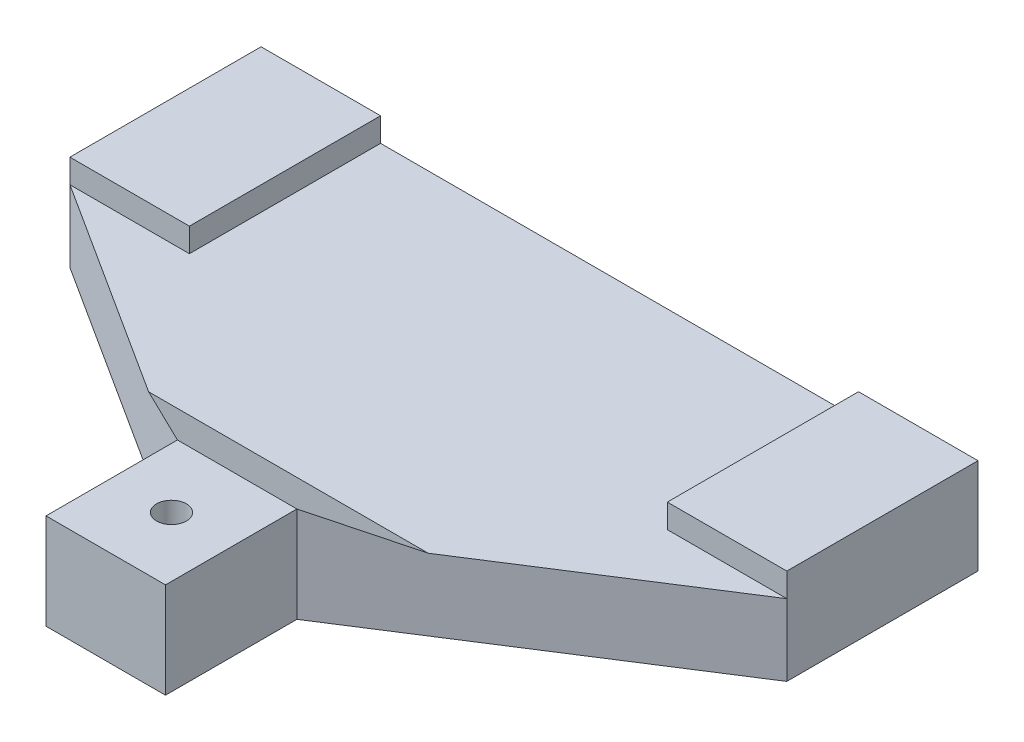
ISO-10303-21;
HEADER;
FILE_DESCRIPTION(('STEP AP214'),'2;1');
FILE_NAME('part.step','',(''),(''),'','','');
FILE_SCHEMA(('AUTOMOTIVE_DESIGN { 1 0 10303 214 1 1 1 1 }'));
ENDSEC;
DATA;
#1=APPLICATION_CONTEXT('core data for automotive mechanical design processes');
#2=APPLICATION_PROTOCOL_DEFINITION('international standard','automotive_design',2000,#1);
#3=PRODUCT_CONTEXT('',#1,'mechanical');
#4=PRODUCT('Part','Part','',(#3));
#5=PRODUCT_RELATED_PRODUCT_CATEGORY('part','',(#4));
#6=PRODUCT_DEFINITION_FORMATION('','',#4);
#7=PRODUCT_DEFINITION_CONTEXT('part definition',#1,'design');
#8=PRODUCT_DEFINITION('design','',#6,#7);
#9=PRODUCT_DEFINITION_SHAPE('','',#8);
#10=(LENGTH_UNIT() NAMED_UNIT(*) SI_UNIT(.MILLI.,.METRE.));
#11=(NAMED_UNIT(*) PLANE_ANGLE_UNIT() SI_UNIT($,.RADIAN.));
#12=(NAMED_UNIT(*) SI_UNIT($,.STERADIAN.) SOLID_ANGLE_UNIT());
#13=UNCERTAINTY_MEASURE_WITH_UNIT(LENGTH_MEASURE(1.E-05),#10,'distance_accuracy_value','');
#14=(GEOMETRIC_REPRESENTATION_CONTEXT(3) GLOBAL_UNCERTAINTY_ASSIGNED_CONTEXT((#13)) GLOBAL_UNIT_ASSIGNED_CONTEXT((#10,
#11,#12)) REPRESENTATION_CONTEXT('',''));
#15=CARTESIAN_POINT('',(0.,0.,0.));
#16=DIRECTION('',(0.,0.,1.));
#17=DIRECTION('',(1.,0.,0.));
#18=AXIS2_PLACEMENT_3D('',#15,#16,#17);
#19=CARTESIAN_POINT('',(0.,8.,60.));
#20=DIRECTION('',(0.,-1.,0.));
#21=DIRECTION('',(0.,0.,-1.));
#22=AXIS2_PLACEMENT_3D('',#19,#20,#21);
#23=PLANE('',#22);
#24=DIRECTION('',(0.,0.,-1.));
#25=VECTOR('',#24,1.);
#26=CARTESIAN_POINT('',(0.,8.,60.));
#27=LINE('',#26,#25);
#28=CARTESIAN_POINT('',(0.,8.,16.));
#29=VERTEX_POINT('',#28);
#30=CARTESIAN_POINT('',(0.,8.,0.));
#31=VERTEX_POINT('',#30);
#32=EDGE_CURVE('E228',#29,#31,#27,.T.);
#33=ORIENTED_EDGE('',*,*,#32,.F.);
#34=DIRECTION('',(-1.,0.,0.));
#35=VECTOR('',#34,1.);
#36=CARTESIAN_POINT('',(0.,8.,16.));
#37=LINE('',#36,#35);
#38=CARTESIAN_POINT('',(10.,8.,16.));
#39=VERTEX_POINT('',#38);
#40=EDGE_CURVE('E164',#39,#29,#37,.T.);
#41=ORIENTED_EDGE('',*,*,#40,.F.);
#42=DIRECTION('',(0.,0.,1.));
#43=VECTOR('',#42,1.);
#44=CARTESIAN_POINT('',(10.,8.,16.));
#45=LINE('',#44,#43);
#46=CARTESIAN_POINT('',(10.,8.,0.));
#47=VERTEX_POINT('',#46);
#48=EDGE_CURVE('E180',#47,#39,#45,.T.);
#49=ORIENTED_EDGE('',*,*,#48,.F.);
#50=DIRECTION('',(-1.,0.,0.));
#51=VECTOR('',#50,1.);
#52=CARTESIAN_POINT('',(0.,8.,0.));
#53=LINE('',#52,#51);
#54=EDGE_CURVE('E224',#47,#31,#53,.T.);
#55=ORIENTED_EDGE('',*,*,#54,.T.);
#56=EDGE_LOOP('',(#33,#41,#49,#55));
#57=FACE_BOUND('',#56,.T.);
#58=ADVANCED_FACE('F33',(#57),#23,.F.);
#59=CARTESIAN_POINT('',(30.,8.,37.5));
#60=DIRECTION('',(0.,1.,0.));
#61=DIRECTION('',(0.,0.,1.));
#62=AXIS2_PLACEMENT_3D('',#59,#60,#61);
#63=CIRCLE('',#62,1.25);
#64=CARTESIAN_POINT('',(30.,8.,38.75));
#65=VERTEX_POINT('',#64);
#66=EDGE_CURVE('E187',#65,#65,#63,.T.);
#67=ORIENTED_EDGE('',*,*,#66,.F.);
#68=EDGE_LOOP('',(#67));
#69=FACE_BOUND('',#68,.T.);
#70=DIRECTION('',(0.,0.,1.));
#71=VECTOR('',#70,1.);
#72=CARTESIAN_POINT('',(25.,8.,32.));
#73=LINE('',#72,#71);
#74=CARTESIAN_POINT('',(25.,7.99999999999999,32.));
#75=VERTEX_POINT('',#74);
#76=CARTESIAN_POINT('',(25.,8.,43.));
#77=VERTEX_POINT('',#76);
#78=EDGE_CURVE('E152',#75,#77,#73,.T.);
#79=ORIENTED_EDGE('',*,*,#78,.T.);
#80=DIRECTION('',(1.,0.,0.));
#81=VECTOR('',#80,1.);
#82=CARTESIAN_POINT('',(25.,8.,43.));
#83=LINE('',#82,#81);
#84=CARTESIAN_POINT('',(35.,8.,43.));
#85=VERTEX_POINT('',#84);
#86=EDGE_CURVE('E137',#77,#85,#83,.T.);
#87=ORIENTED_EDGE('',*,*,#86,.T.);
#88=DIRECTION('',(0.,0.,-1.));
#89=VECTOR('',#88,1.);
#90=CARTESIAN_POINT('',(35.,8.,43.));
#91=LINE('',#90,#89);
#92=CARTESIAN_POINT('',(35.,8.,32.));
#93=VERTEX_POINT('',#92);
#94=EDGE_CURVE('E127',#85,#93,#91,.T.);
#95=ORIENTED_EDGE('',*,*,#94,.T.);
#96=DIRECTION('',(-1.,0.,0.));
#97=VECTOR('',#96,1.);
#98=CARTESIAN_POINT('',(35.,8.,32.));
#99=LINE('',#98,#97);
#100=EDGE_CURVE('E136',#93,#75,#99,.T.);
#101=ORIENTED_EDGE('',*,*,#100,.T.);
#102=EDGE_LOOP('',(#79,#87,#95,#101));
#103=FACE_BOUND('',#102,.T.);
#104=ADVANCED_FACE('F150',(#69,#103),#23,.F.);
#105=CARTESIAN_POINT('',(0.,0.,60.));
#106=DIRECTION('',(1.,0.,0.));
#107=DIRECTION('',(0.,0.,-1.));
#108=AXIS2_PLACEMENT_3D('',#105,#106,#107);
#109=PLANE('',#108);
#110=DIRECTION('',(0.,0.,-1.));
#111=VECTOR('',#110,1.);
#112=CARTESIAN_POINT('',(0.,0.,60.));
#113=LINE('',#112,#111);
#114=CARTESIAN_POINT('',(0.,0.,16.));
#115=VERTEX_POINT('',#114);
#116=CARTESIAN_POINT('',(0.,0.,0.));
#117=VERTEX_POINT('',#116);
#118=EDGE_CURVE('E234',#115,#117,#113,.T.);
#119=ORIENTED_EDGE('',*,*,#118,.F.);
#120=DIRECTION('',(0.,1.,0.));
#121=VECTOR('',#120,1.);
#122=CARTESIAN_POINT('',(0.,-46.,16.));
#123=LINE('',#122,#121);
#124=CARTESIAN_POINT('',(0.,6.,16.));
#125=VERTEX_POINT('',#124);
#126=EDGE_CURVE('E80',#115,#125,#123,.T.);
#127=ORIENTED_EDGE('',*,*,#126,.T.);
#128=DIRECTION('',(0.,1.,0.));
#129=VECTOR('',#128,1.);
#130=CARTESIAN_POINT('',(0.,6.,16.));
#131=LINE('',#130,#129);
#132=EDGE_CURVE('E184',#125,#29,#131,.T.);
#133=ORIENTED_EDGE('',*,*,#132,.T.);
#134=ORIENTED_EDGE('',*,*,#32,.T.);
#135=DIRECTION('',(0.,-1.,0.));
#136=VECTOR('',#135,1.);
#137=CARTESIAN_POINT('',(0.,0.,0.));
#138=LINE('',#137,#136);
#139=EDGE_CURVE('E213',#31,#117,#138,.T.);
#140=ORIENTED_EDGE('',*,*,#139,.T.);
#141=EDGE_LOOP('',(#119,#127,#133,#134,#140));
#142=FACE_BOUND('',#141,.T.);
#143=ADVANCED_FACE('F275',(#142),#109,.F.);
#144=CARTESIAN_POINT('',(0.,0.,60.));
#145=DIRECTION('',(0.,1.,0.));
#146=DIRECTION('',(0.,0.,1.));
#147=AXIS2_PLACEMENT_3D('',#144,#145,#146);
#148=PLANE('',#147);
#149=CARTESIAN_POINT('',(30.,0.,37.5));
#150=DIRECTION('',(0.,1.,0.));
#151=DIRECTION('',(0.,0.,1.));
#152=AXIS2_PLACEMENT_3D('',#149,#150,#151);
#153=CIRCLE('',#152,1.25);
#154=CARTESIAN_POINT('',(30.,0.,38.75));
#155=VERTEX_POINT('',#154);
#156=EDGE_CURVE('E200',#155,#155,#153,.T.);
#157=ORIENTED_EDGE('',*,*,#156,.T.);
#158=EDGE_LOOP('',(#157));
#159=FACE_BOUND('',#158,.T.);
#160=DIRECTION('',(0.,0.,-1.));
#161=VECTOR('',#160,1.);
#162=CARTESIAN_POINT('',(25.,0.,60.));
#163=LINE('',#162,#161);
#164=CARTESIAN_POINT('',(25.,0.,43.));
#165=VERTEX_POINT('',#164);
#166=CARTESIAN_POINT('',(25.,0.,32.));
#167=VERTEX_POINT('',#166);
#168=EDGE_CURVE('E267',#165,#167,#163,.T.);
#169=ORIENTED_EDGE('',*,*,#168,.T.);
#170=DIRECTION('',(-0.842271400661512,0.,-0.539053696423367));
#171=VECTOR('',#170,1.);
#172=CARTESIAN_POINT('',(19.9772985244041,0.,28.7854710556186));
#173=LINE('',#172,#171);
#174=EDGE_CURVE('E154',#167,#115,#173,.T.);
#175=ORIENTED_EDGE('',*,*,#174,.T.);
#176=ORIENTED_EDGE('',*,*,#118,.T.);
#177=DIRECTION('',(1.,0.,0.));
#178=VECTOR('',#177,1.);
#179=CARTESIAN_POINT('',(0.,0.,0.));
#180=LINE('',#179,#178);
#181=CARTESIAN_POINT('',(60.,0.,0.));
#182=VERTEX_POINT('',#181);
#183=EDGE_CURVE('E218',#117,#182,#180,.T.);
#184=ORIENTED_EDGE('',*,*,#183,.T.);
#185=DIRECTION('',(0.,0.,-1.));
#186=VECTOR('',#185,1.);
#187=CARTESIAN_POINT('',(60.,0.,60.));
#188=LINE('',#187,#186);
#189=CARTESIAN_POINT('',(60.,0.,16.));
#190=VERTEX_POINT('',#189);
#191=EDGE_CURVE('E232',#190,#182,#188,.T.);
#192=ORIENTED_EDGE('',*,*,#191,.F.);
#193=DIRECTION('',(-0.842271400661512,0.,0.539053696423367));
#194=VECTOR('',#193,1.);
#195=CARTESIAN_POINT('',(-2.54256526674234,0.,56.0272417707151));
#196=LINE('',#195,#194);
#197=CARTESIAN_POINT('',(35.,0.,32.));
#198=VERTEX_POINT('',#197);
#199=EDGE_CURVE('E259',#190,#198,#196,.T.);
#200=ORIENTED_EDGE('',*,*,#199,.T.);
#201=DIRECTION('',(0.,0.,1.));
#202=VECTOR('',#201,1.);
#203=CARTESIAN_POINT('',(35.,0.,60.));
#204=LINE('',#203,#202);
#205=CARTESIAN_POINT('',(35.,0.,43.));
#206=VERTEX_POINT('',#205);
#207=EDGE_CURVE('E264',#198,#206,#204,.T.);
#208=ORIENTED_EDGE('',*,*,#207,.T.);
#209=DIRECTION('',(-1.,0.,0.));
#210=VECTOR('',#209,1.);
#211=CARTESIAN_POINT('',(0.,0.,43.));
#212=LINE('',#211,#210);
#213=EDGE_CURVE('E145',#206,#165,#212,.T.);
#214=ORIENTED_EDGE('',*,*,#213,.T.);
#215=EDGE_LOOP('',(#169,#175,#176,#184,#192,#200,#208,#214));
#216=FACE_BOUND('',#215,.T.);
#217=ADVANCED_FACE('F271',(#159,#216),#148,.F.);
#218=CARTESIAN_POINT('',(60.,0.,60.));
#219=DIRECTION('',(-1.,0.,0.));
#220=DIRECTION('',(0.,0.,1.));
#221=AXIS2_PLACEMENT_3D('',#218,#219,#220);
#222=PLANE('',#221);
#223=DIRECTION('',(0.,1.,0.));
#224=VECTOR('',#223,1.);
#225=CARTESIAN_POINT('',(60.,6.,16.));
#226=LINE('',#225,#224);
#227=CARTESIAN_POINT('',(60.,6.,16.));
#228=VERTEX_POINT('',#227);
#229=CARTESIAN_POINT('',(60.,8.,16.));
#230=VERTEX_POINT('',#229);
#231=EDGE_CURVE('E175',#228,#230,#226,.T.);
#232=ORIENTED_EDGE('',*,*,#231,.F.);
#233=DIRECTION('',(0.,1.,0.));
#234=VECTOR('',#233,1.);
#235=CARTESIAN_POINT('',(60.,-46.,16.));
#236=LINE('',#235,#234);
#237=EDGE_CURVE('E243',#190,#228,#236,.T.);
#238=ORIENTED_EDGE('',*,*,#237,.F.);
#239=ORIENTED_EDGE('',*,*,#191,.T.);
#240=DIRECTION('',(0.,1.,0.));
#241=VECTOR('',#240,1.);
#242=CARTESIAN_POINT('',(60.,0.,0.));
#243=LINE('',#242,#241);
#244=CARTESIAN_POINT('',(60.,8.,0.));
#245=VERTEX_POINT('',#244);
#246=EDGE_CURVE('E221',#182,#245,#243,.T.);
#247=ORIENTED_EDGE('',*,*,#246,.T.);
#248=DIRECTION('',(0.,0.,-1.));
#249=VECTOR('',#248,1.);
#250=CARTESIAN_POINT('',(60.,8.,60.));
#251=LINE('',#250,#249);
#252=EDGE_CURVE('E230',#230,#245,#251,.T.);
#253=ORIENTED_EDGE('',*,*,#252,.F.);
#254=EDGE_LOOP('',(#232,#238,#239,#247,#253));
#255=FACE_BOUND('',#254,.T.);
#256=ADVANCED_FACE('F292',(#255),#222,.F.);
#257=CARTESIAN_POINT('',(50.,8.,0.));
#258=VERTEX_POINT('',#257);
#259=EDGE_CURVE('E225',#245,#258,#53,.T.);
#260=ORIENTED_EDGE('',*,*,#259,.T.);
#261=DIRECTION('',(0.,0.,-1.));
#262=VECTOR('',#261,1.);
#263=CARTESIAN_POINT('',(50.,8.,0.));
#264=LINE('',#263,#262);
#265=CARTESIAN_POINT('',(50.,8.,16.));
#266=VERTEX_POINT('',#265);
#267=EDGE_CURVE('E178',#266,#258,#264,.T.);
#268=ORIENTED_EDGE('',*,*,#267,.F.);
#269=DIRECTION('',(-1.,0.,0.));
#270=VECTOR('',#269,1.);
#271=CARTESIAN_POINT('',(50.,8.,16.));
#272=LINE('',#271,#270);
#273=EDGE_CURVE('E147',#230,#266,#272,.T.);
#274=ORIENTED_EDGE('',*,*,#273,.F.);
#275=ORIENTED_EDGE('',*,*,#252,.T.);
#276=EDGE_LOOP('',(#260,#268,#274,#275));
#277=FACE_BOUND('',#276,.T.);
#278=ADVANCED_FACE('F300',(#277),#23,.F.);
#279=CARTESIAN_POINT('',(0.,0.,0.));
#280=DIRECTION('',(0.,0.,-1.));
#281=DIRECTION('',(-1.,0.,0.));
#282=AXIS2_PLACEMENT_3D('',#279,#280,#281);
#283=PLANE('',#282);
#284=DIRECTION('',(0.,1.,0.));
#285=VECTOR('',#284,1.);
#286=CARTESIAN_POINT('',(10.,6.,0.));
#287=LINE('',#286,#285);
#288=CARTESIAN_POINT('',(10.,6.,0.));
#289=VERTEX_POINT('',#288);
#290=EDGE_CURVE('E190',#289,#47,#287,.T.);
#291=ORIENTED_EDGE('',*,*,#290,.F.);
#292=DIRECTION('',(-1.,0.,0.));
#293=VECTOR('',#292,1.);
#294=CARTESIAN_POINT('',(10.,6.,0.));
#295=LINE('',#294,#293);
#296=CARTESIAN_POINT('',(50.,6.,0.));
#297=VERTEX_POINT('',#296);
#298=EDGE_CURVE('E166',#297,#289,#295,.T.);
#299=ORIENTED_EDGE('',*,*,#298,.F.);
#300=DIRECTION('',(0.,1.,0.));
#301=VECTOR('',#300,1.);
#302=CARTESIAN_POINT('',(50.,6.,0.));
#303=LINE('',#302,#301);
#304=EDGE_CURVE('E192',#297,#258,#303,.T.);
#305=ORIENTED_EDGE('',*,*,#304,.T.);
#306=ORIENTED_EDGE('',*,*,#259,.F.);
#307=ORIENTED_EDGE('',*,*,#246,.F.);
#308=ORIENTED_EDGE('',*,*,#183,.F.);
#309=ORIENTED_EDGE('',*,*,#139,.F.);
#310=ORIENTED_EDGE('',*,*,#54,.F.);
#311=EDGE_LOOP('',(#291,#299,#305,#306,#307,#308,#309,#310));
#312=FACE_BOUND('',#311,.T.);
#313=CARTESIAN_POINT('',(5.75,4.,0.));
#314=DIRECTION('',(0.,0.,-1.));
#315=DIRECTION('',(-1.,0.,0.));
#316=AXIS2_PLACEMENT_3D('',#313,#314,#315);
#317=CIRCLE('',#316,1.25);
#318=CARTESIAN_POINT('',(4.5,4.,0.));
#319=VERTEX_POINT('',#318);
#320=EDGE_CURVE('E203',#319,#319,#317,.T.);
#321=ORIENTED_EDGE('',*,*,#320,.F.);
#322=EDGE_LOOP('',(#321));
#323=FACE_BOUND('',#322,.T.);
#324=CARTESIAN_POINT('',(54.,4.,0.));
#325=DIRECTION('',(0.,0.,-1.));
#326=DIRECTION('',(-1.,0.,0.));
#327=AXIS2_PLACEMENT_3D('',#324,#325,#326);
#328=CIRCLE('',#327,1.25);
#329=CARTESIAN_POINT('',(52.75,4.,0.));
#330=VERTEX_POINT('',#329);
#331=EDGE_CURVE('E207',#330,#330,#328,.T.);
#332=ORIENTED_EDGE('',*,*,#331,.F.);
#333=EDGE_LOOP('',(#332));
#334=FACE_BOUND('',#333,.T.);
#335=ADVANCED_FACE('F283',(#312,#323,#334),#283,.T.);
#336=CARTESIAN_POINT('',(54.,4.,15.));
#337=DIRECTION('',(0.,0.,-1.));
#338=DIRECTION('',(-1.,0.,0.));
#339=AXIS2_PLACEMENT_3D('',#336,#337,#338);
#340=CYLINDRICAL_SURFACE('',#339,1.25);
#341=CARTESIAN_POINT('',(54.,4.,15.));
#342=DIRECTION('',(0.,0.,-1.));
#343=DIRECTION('',(-1.,0.,0.));
#344=AXIS2_PLACEMENT_3D('',#341,#342,#343);
#345=CIRCLE('',#344,1.25);
#346=CARTESIAN_POINT('',(52.75,4.,15.));
#347=VERTEX_POINT('',#346);
#348=EDGE_CURVE('E210',#347,#347,#345,.T.);
#349=ORIENTED_EDGE('',*,*,#348,.F.);
#350=EDGE_LOOP('',(#349));
#351=FACE_BOUND('',#350,.T.);
#352=ORIENTED_EDGE('',*,*,#331,.T.);
#353=EDGE_LOOP('',(#352));
#354=FACE_BOUND('',#353,.T.);
#355=ADVANCED_FACE('F336',(#351,#354),#340,.F.);
#356=CARTESIAN_POINT('',(54.,4.,15.));
#357=DIRECTION('',(0.,0.,-1.));
#358=DIRECTION('',(-1.,0.,0.));
#359=AXIS2_PLACEMENT_3D('',#356,#357,#358);
#360=PLANE('',#359);
#361=ORIENTED_EDGE('',*,*,#348,.T.);
#362=EDGE_LOOP('',(#361));
#363=FACE_BOUND('',#362,.T.);
#364=ADVANCED_FACE('F482',(#363),#360,.T.);
#365=CARTESIAN_POINT('',(5.75,4.,15.));
#366=DIRECTION('',(0.,0.,-1.));
#367=DIRECTION('',(-1.,0.,0.));
#368=AXIS2_PLACEMENT_3D('',#365,#366,#367);
#369=CYLINDRICAL_SURFACE('',#368,1.25);
#370=CARTESIAN_POINT('',(5.75,4.,15.));
#371=DIRECTION('',(0.,0.,-1.));
#372=DIRECTION('',(-1.,0.,0.));
#373=AXIS2_PLACEMENT_3D('',#370,#371,#372);
#374=CIRCLE('',#373,1.25);
#375=CARTESIAN_POINT('',(4.5,4.,15.));
#376=VERTEX_POINT('',#375);
#377=EDGE_CURVE('E204',#376,#376,#374,.T.);
#378=ORIENTED_EDGE('',*,*,#377,.F.);
#379=EDGE_LOOP('',(#378));
#380=FACE_BOUND('',#379,.T.);
#381=ORIENTED_EDGE('',*,*,#320,.T.);
#382=EDGE_LOOP('',(#381));
#383=FACE_BOUND('',#382,.T.);
#384=ADVANCED_FACE('F489',(#380,#383),#369,.F.);
#385=CARTESIAN_POINT('',(5.75,4.,15.));
#386=DIRECTION('',(0.,0.,-1.));
#387=DIRECTION('',(-1.,0.,0.));
#388=AXIS2_PLACEMENT_3D('',#385,#386,#387);
#389=PLANE('',#388);
#390=ORIENTED_EDGE('',*,*,#377,.T.);
#391=EDGE_LOOP('',(#390));
#392=FACE_BOUND('',#391,.T.);
#393=ADVANCED_FACE('F497',(#392),#389,.T.);
#394=CARTESIAN_POINT('',(30.,-7.,37.5));
#395=DIRECTION('',(0.,1.,0.));
#396=DIRECTION('',(0.,0.,1.));
#397=AXIS2_PLACEMENT_3D('',#394,#395,#396);
#398=CYLINDRICAL_SURFACE('',#397,1.25);
#399=ORIENTED_EDGE('',*,*,#66,.T.);
#400=EDGE_LOOP('',(#399));
#401=FACE_BOUND('',#400,.T.);
#402=ORIENTED_EDGE('',*,*,#156,.F.);
#403=EDGE_LOOP('',(#402));
#404=FACE_BOUND('',#403,.T.);
#405=ADVANCED_FACE('F321',(#401,#404),#398,.F.);
#406=CARTESIAN_POINT('',(0.,6.,16.));
#407=DIRECTION('',(0.,0.,-1.));
#408=DIRECTION('',(-1.,0.,0.));
#409=AXIS2_PLACEMENT_3D('',#406,#407,#408);
#410=PLANE('',#409);
#411=ORIENTED_EDGE('',*,*,#40,.T.);
#412=ORIENTED_EDGE('',*,*,#132,.F.);
#413=DIRECTION('',(-1.,0.,0.));
#414=VECTOR('',#413,1.);
#415=CARTESIAN_POINT('',(0.,6.,16.));
#416=LINE('',#415,#414);
#417=CARTESIAN_POINT('',(10.,6.,16.));
#418=VERTEX_POINT('',#417);
#419=EDGE_CURVE('E172',#418,#125,#416,.T.);
#420=ORIENTED_EDGE('',*,*,#419,.F.);
#421=DIRECTION('',(0.,1.,0.));
#422=VECTOR('',#421,1.);
#423=CARTESIAN_POINT('',(10.,6.,16.));
#424=LINE('',#423,#422);
#425=EDGE_CURVE('E188',#418,#39,#424,.T.);
#426=ORIENTED_EDGE('',*,*,#425,.T.);
#427=EDGE_LOOP('',(#411,#412,#420,#426));
#428=FACE_BOUND('',#427,.T.);
#429=ADVANCED_FACE('F308',(#428),#410,.F.);
#430=CARTESIAN_POINT('',(10.,6.,16.));
#431=DIRECTION('',(-1.,0.,0.));
#432=DIRECTION('',(0.,0.,1.));
#433=AXIS2_PLACEMENT_3D('',#430,#431,#432);
#434=PLANE('',#433);
#435=ORIENTED_EDGE('',*,*,#48,.T.);
#436=ORIENTED_EDGE('',*,*,#425,.F.);
#437=DIRECTION('',(0.,0.,1.));
#438=VECTOR('',#437,1.);
#439=CARTESIAN_POINT('',(10.,6.,16.));
#440=LINE('',#439,#438);
#441=EDGE_CURVE('E169',#289,#418,#440,.T.);
#442=ORIENTED_EDGE('',*,*,#441,.F.);
#443=ORIENTED_EDGE('',*,*,#290,.T.);
#444=EDGE_LOOP('',(#435,#436,#442,#443));
#445=FACE_BOUND('',#444,.T.);
#446=ADVANCED_FACE('F313',(#445),#434,.F.);
#447=CARTESIAN_POINT('',(50.,6.,0.));
#448=DIRECTION('',(1.,0.,0.));
#449=DIRECTION('',(0.,0.,-1.));
#450=AXIS2_PLACEMENT_3D('',#447,#448,#449);
#451=PLANE('',#450);
#452=ORIENTED_EDGE('',*,*,#267,.T.);
#453=ORIENTED_EDGE('',*,*,#304,.F.);
#454=DIRECTION('',(0.,0.,-1.));
#455=VECTOR('',#454,1.);
#456=CARTESIAN_POINT('',(50.,6.,0.));
#457=LINE('',#456,#455);
#458=CARTESIAN_POINT('',(50.,6.,16.));
#459=VERTEX_POINT('',#458);
#460=EDGE_CURVE('E163',#459,#297,#457,.T.);
#461=ORIENTED_EDGE('',*,*,#460,.F.);
#462=DIRECTION('',(0.,1.,0.));
#463=VECTOR('',#462,1.);
#464=CARTESIAN_POINT('',(50.,6.,16.));
#465=LINE('',#464,#463);
#466=EDGE_CURVE('E195',#459,#266,#465,.T.);
#467=ORIENTED_EDGE('',*,*,#466,.T.);
#468=EDGE_LOOP('',(#452,#453,#461,#467));
#469=FACE_BOUND('',#468,.T.);
#470=ADVANCED_FACE('F303',(#469),#451,.F.);
#471=CARTESIAN_POINT('',(50.,6.,16.));
#472=DIRECTION('',(0.,0.,-1.));
#473=DIRECTION('',(-1.,0.,0.));
#474=AXIS2_PLACEMENT_3D('',#471,#472,#473);
#475=PLANE('',#474);
#476=ORIENTED_EDGE('',*,*,#273,.T.);
#477=ORIENTED_EDGE('',*,*,#466,.F.);
#478=DIRECTION('',(-1.,0.,0.));
#479=VECTOR('',#478,1.);
#480=CARTESIAN_POINT('',(50.,6.,16.));
#481=LINE('',#480,#479);
#482=EDGE_CURVE('E160',#228,#459,#481,.T.);
#483=ORIENTED_EDGE('',*,*,#482,.F.);
#484=ORIENTED_EDGE('',*,*,#231,.T.);
#485=EDGE_LOOP('',(#476,#477,#483,#484));
#486=FACE_BOUND('',#485,.T.);
#487=ADVANCED_FACE('F297',(#486),#475,.F.);
#488=CARTESIAN_POINT('',(0.,6.,0.));
#489=DIRECTION('',(0.,-1.,0.));
#490=DIRECTION('',(0.,0.,-1.));
#491=AXIS2_PLACEMENT_3D('',#488,#489,#490);
#492=PLANE('',#491);
#493=DIRECTION('',(-0.842271400661512,0.,-0.539053696423367));
#494=VECTOR('',#493,1.);
#495=CARTESIAN_POINT('',(25.,6.,32.));
#496=LINE('',#495,#494);
#497=CARTESIAN_POINT('',(18.2984158734076,6.,27.7109861589808));
#498=VERTEX_POINT('',#497);
#499=EDGE_CURVE('E238',#498,#125,#496,.T.);
#500=ORIENTED_EDGE('',*,*,#499,.F.);
#501=DIRECTION('',(1.,0.,0.));
#502=VECTOR('',#501,1.);
#503=CARTESIAN_POINT('',(0.,6.,27.7109861589808));
#504=LINE('',#503,#502);
#505=CARTESIAN_POINT('',(41.7015841265924,6.,27.7109861589808));
#506=VERTEX_POINT('',#505);
#507=EDGE_CURVE('E57',#498,#506,#504,.T.);
#508=ORIENTED_EDGE('',*,*,#507,.T.);
#509=DIRECTION('',(-0.842271400661512,0.,0.539053696423367));
#510=VECTOR('',#509,1.);
#511=CARTESIAN_POINT('',(60.,6.,16.));
#512=LINE('',#511,#510);
#513=EDGE_CURVE('E244',#228,#506,#512,.T.);
#514=ORIENTED_EDGE('',*,*,#513,.F.);
#515=ORIENTED_EDGE('',*,*,#482,.T.);
#516=ORIENTED_EDGE('',*,*,#460,.T.);
#517=ORIENTED_EDGE('',*,*,#298,.T.);
#518=ORIENTED_EDGE('',*,*,#441,.T.);
#519=ORIENTED_EDGE('',*,*,#419,.T.);
#520=EDGE_LOOP('',(#500,#508,#514,#515,#516,#517,#518,#519));
#521=FACE_BOUND('',#520,.T.);
#522=ADVANCED_FACE('F241',(#521),#492,.F.);
#523=CARTESIAN_POINT('',(25.,6.,32.));
#524=DIRECTION('',(-1.,0.,0.));
#525=DIRECTION('',(0.,0.,1.));
#526=AXIS2_PLACEMENT_3D('',#523,#524,#525);
#527=PLANE('',#526);
#528=ORIENTED_EDGE('',*,*,#78,.F.);
#529=DIRECTION('',(0.,1.,0.));
#530=VECTOR('',#529,1.);
#531=CARTESIAN_POINT('',(25.,-46.,32.));
#532=LINE('',#531,#530);
#533=EDGE_CURVE('E70',#167,#75,#532,.T.);
#534=ORIENTED_EDGE('',*,*,#533,.F.);
#535=ORIENTED_EDGE('',*,*,#168,.F.);
#536=DIRECTION('',(0.,1.,0.));
#537=VECTOR('',#536,1.);
#538=CARTESIAN_POINT('',(25.,6.,43.));
#539=LINE('',#538,#537);
#540=EDGE_CURVE('E148',#165,#77,#539,.T.);
#541=ORIENTED_EDGE('',*,*,#540,.T.);
#542=EDGE_LOOP('',(#528,#534,#535,#541));
#543=FACE_BOUND('',#542,.T.);
#544=ADVANCED_FACE('F402',(#543),#527,.T.);
#545=CARTESIAN_POINT('',(35.,6.,43.));
#546=DIRECTION('',(1.,0.,0.));
#547=DIRECTION('',(0.,0.,-1.));
#548=AXIS2_PLACEMENT_3D('',#545,#546,#547);
#549=PLANE('',#548);
#550=ORIENTED_EDGE('',*,*,#94,.F.);
#551=DIRECTION('',(0.,1.,0.));
#552=VECTOR('',#551,1.);
#553=CARTESIAN_POINT('',(35.,6.,43.));
#554=LINE('',#553,#552);
#555=EDGE_CURVE('E131',#206,#85,#554,.T.);
#556=ORIENTED_EDGE('',*,*,#555,.F.);
#557=ORIENTED_EDGE('',*,*,#207,.F.);
#558=DIRECTION('',(0.,1.,0.));
#559=VECTOR('',#558,1.);
#560=CARTESIAN_POINT('',(35.,-46.,32.));
#561=LINE('',#560,#559);
#562=EDGE_CURVE('E48',#198,#93,#561,.T.);
#563=ORIENTED_EDGE('',*,*,#562,.T.);
#564=EDGE_LOOP('',(#550,#556,#557,#563));
#565=FACE_BOUND('',#564,.T.);
#566=ADVANCED_FACE('F129',(#565),#549,.T.);
#567=CARTESIAN_POINT('',(25.,6.,43.));
#568=DIRECTION('',(0.,0.,1.));
#569=DIRECTION('',(1.,0.,0.));
#570=AXIS2_PLACEMENT_3D('',#567,#568,#569);
#571=PLANE('',#570);
#572=ORIENTED_EDGE('',*,*,#86,.F.);
#573=ORIENTED_EDGE('',*,*,#540,.F.);
#574=ORIENTED_EDGE('',*,*,#213,.F.);
#575=ORIENTED_EDGE('',*,*,#555,.T.);
#576=EDGE_LOOP('',(#572,#573,#574,#575));
#577=FACE_BOUND('',#576,.T.);
#578=ADVANCED_FACE('F141',(#577),#571,.T.);
#579=CARTESIAN_POINT('',(25.,-46.,32.));
#580=DIRECTION('',(0.539053696423367,0.,-0.842271400661512));
#581=DIRECTION('',(-0.842271400661512,0.,-0.539053696423367));
#582=AXIS2_PLACEMENT_3D('',#579,#580,#581);
#583=PLANE('',#582);
#584=ORIENTED_EDGE('',*,*,#533,.T.);
#585=DIRECTION('',(-0.816860277986021,-0.243781250091198,-0.522790577911053));
#586=VECTOR('',#585,1.);
#587=CARTESIAN_POINT('',(14.2466981352671,4.79081791361451,25.1178868065709));
#588=LINE('',#587,#586);
#589=EDGE_CURVE('E41',#75,#498,#588,.T.);
#590=ORIENTED_EDGE('',*,*,#589,.T.);
#591=ORIENTED_EDGE('',*,*,#499,.T.);
#592=ORIENTED_EDGE('',*,*,#126,.F.);
#593=ORIENTED_EDGE('',*,*,#174,.F.);
#594=EDGE_LOOP('',(#584,#590,#591,#592,#593));
#595=FACE_BOUND('',#594,.T.);
#596=ADVANCED_FACE('F236',(#595),#583,.F.);
#597=CARTESIAN_POINT('',(60.,-46.,16.));
#598=DIRECTION('',(-0.539053696423367,0.,-0.842271400661512));
#599=DIRECTION('',(-0.842271400661512,0.,0.539053696423367));
#600=AXIS2_PLACEMENT_3D('',#597,#598,#599);
#601=PLANE('',#600);
#602=ORIENTED_EDGE('',*,*,#237,.T.);
#603=ORIENTED_EDGE('',*,*,#513,.T.);
#604=DIRECTION('',(-0.816860277986021,0.243781250091198,0.522790577911053));
#605=VECTOR('',#604,1.);
#606=CARTESIAN_POINT('',(69.2675694173322,-2.22670722922229,10.0687555729074));
#607=LINE('',#606,#605);
#608=EDGE_CURVE('E11',#506,#93,#607,.T.);
#609=ORIENTED_EDGE('',*,*,#608,.T.);
#610=ORIENTED_EDGE('',*,*,#562,.F.);
#611=ORIENTED_EDGE('',*,*,#199,.F.);
#612=EDGE_LOOP('',(#602,#603,#609,#610,#611));
#613=FACE_BOUND('',#612,.T.);
#614=ADVANCED_FACE('F249',(#613),#601,.F.);
#615=CARTESIAN_POINT('',(35.,7.99999999999999,32.));
#616=DIRECTION('',(0.,-0.906307787036652,0.422618261740695));
#617=DIRECTION('',(-1.,0.,0.));
#618=AXIS2_PLACEMENT_3D('',#615,#616,#617);
#619=PLANE('',#618);
#620=ORIENTED_EDGE('',*,*,#608,.F.);
#621=ORIENTED_EDGE('',*,*,#507,.F.);
#622=ORIENTED_EDGE('',*,*,#589,.F.);
#623=ORIENTED_EDGE('',*,*,#100,.F.);
#624=EDGE_LOOP('',(#620,#621,#622,#623));
#625=FACE_BOUND('',#624,.T.);
#626=ADVANCED_FACE('F35',(#625),#619,.F.);
#627=CLOSED_SHELL('',(#58,#104,#143,#217,#256,#278,#335,#355,#364,#384,#393,#405,#429,#446,#470,
#487,#522,#544,#566,#578,#596,#614,#626));
#628=MANIFOLD_SOLID_BREP('B2',#627);
#629=ADVANCED_BREP_SHAPE_REPRESENTATION('',(#18,#628),#14);
#630=SHAPE_DEFINITION_REPRESENTATION(#9,#629);
ENDSEC;
END-ISO-10303-21;
